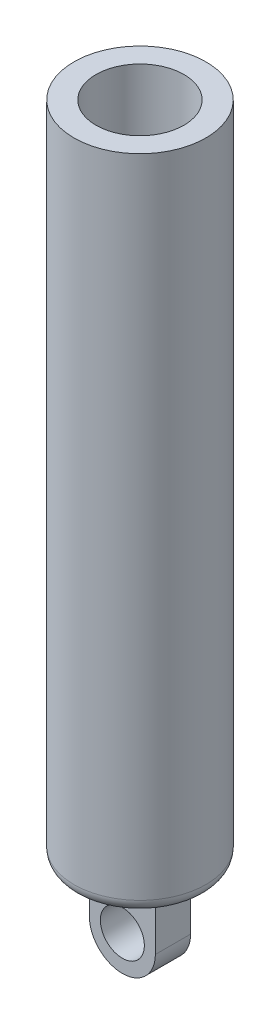
ISO-10303-21;
HEADER;
FILE_DESCRIPTION(('STEP AP214'),'2;1');
FILE_NAME('part.step','',(''),(''),'','','');
FILE_SCHEMA(('AUTOMOTIVE_DESIGN { 1 0 10303 214 1 1 1 1 }'));
ENDSEC;
DATA;
#1=APPLICATION_CONTEXT('core data for automotive mechanical design processes');
#2=APPLICATION_PROTOCOL_DEFINITION('international standard','automotive_design',2000,#1);
#3=PRODUCT_CONTEXT('',#1,'mechanical');
#4=PRODUCT('Part','Part','',(#3));
#5=PRODUCT_RELATED_PRODUCT_CATEGORY('part','',(#4));
#6=PRODUCT_DEFINITION_FORMATION('','',#4);
#7=PRODUCT_DEFINITION_CONTEXT('part definition',#1,'design');
#8=PRODUCT_DEFINITION('design','',#6,#7);
#9=PRODUCT_DEFINITION_SHAPE('','',#8);
#10=(LENGTH_UNIT() NAMED_UNIT(*) SI_UNIT(.MILLI.,.METRE.));
#11=(NAMED_UNIT(*) PLANE_ANGLE_UNIT() SI_UNIT($,.RADIAN.));
#12=(NAMED_UNIT(*) SI_UNIT($,.STERADIAN.) SOLID_ANGLE_UNIT());
#13=UNCERTAINTY_MEASURE_WITH_UNIT(LENGTH_MEASURE(1.E-05),#10,'distance_accuracy_value','');
#14=(GEOMETRIC_REPRESENTATION_CONTEXT(3) GLOBAL_UNCERTAINTY_ASSIGNED_CONTEXT((#13)) GLOBAL_UNIT_ASSIGNED_CONTEXT((#10,
#11,#12)) REPRESENTATION_CONTEXT('',''));
#15=CARTESIAN_POINT('',(0.,0.,0.));
#16=DIRECTION('',(0.,0.,1.));
#17=DIRECTION('',(1.,0.,0.));
#18=AXIS2_PLACEMENT_3D('',#15,#16,#17);
#19=CARTESIAN_POINT('',(7.5,-20.,-4.));
#20=DIRECTION('',(-1.,0.,0.));
#21=DIRECTION('',(0.,0.,1.));
#22=AXIS2_PLACEMENT_3D('',#19,#20,#21);
#23=PLANE('',#22);
#24=DIRECTION('',(0.,1.,0.));
#25=VECTOR('',#24,1.);
#26=CARTESIAN_POINT('',(7.5,-20.,4.));
#27=LINE('',#26,#25);
#28=CARTESIAN_POINT('',(7.5,-12.5,4.));
#29=VERTEX_POINT('',#28);
#30=CARTESIAN_POINT('',(7.5,0.,4.));
#31=VERTEX_POINT('',#30);
#32=EDGE_CURVE('E97',#29,#31,#27,.T.);
#33=ORIENTED_EDGE('',*,*,#32,.F.);
#34=DIRECTION('',(0.,0.,1.));
#35=VECTOR('',#34,1.);
#36=CARTESIAN_POINT('',(7.5,-12.5,-4.));
#37=LINE('',#36,#35);
#38=CARTESIAN_POINT('',(7.5,-12.5,-4.));
#39=VERTEX_POINT('',#38);
#40=EDGE_CURVE('E138',#29,#39,#37,.F.);
#41=ORIENTED_EDGE('',*,*,#40,.T.);
#42=DIRECTION('',(0.,1.,0.));
#43=VECTOR('',#42,1.);
#44=CARTESIAN_POINT('',(7.5,-20.,-4.));
#45=LINE('',#44,#43);
#46=CARTESIAN_POINT('',(7.5,0.,-4.));
#47=VERTEX_POINT('',#46);
#48=EDGE_CURVE('E120',#39,#47,#45,.T.);
#49=ORIENTED_EDGE('',*,*,#48,.T.);
#50=DIRECTION('',(0.,0.,1.));
#51=VECTOR('',#50,1.);
#52=CARTESIAN_POINT('',(7.5,0.,-4.));
#53=LINE('',#52,#51);
#54=EDGE_CURVE('E116',#47,#31,#53,.T.);
#55=ORIENTED_EDGE('',*,*,#54,.T.);
#56=EDGE_LOOP('',(#33,#41,#49,#55));
#57=FACE_BOUND('',#56,.T.);
#58=ADVANCED_FACE('F53',(#57),#23,.F.);
#59=CARTESIAN_POINT('',(-7.5,-20.,4.));
#60=DIRECTION('',(0.,0.,-1.));
#61=DIRECTION('',(-1.,0.,0.));
#62=AXIS2_PLACEMENT_3D('',#59,#60,#61);
#63=PLANE('',#62);
#64=CARTESIAN_POINT('',(0.,-12.,4.));
#65=DIRECTION('',(0.,0.,1.));
#66=DIRECTION('',(1.,0.,0.));
#67=AXIS2_PLACEMENT_3D('',#64,#65,#66);
#68=CIRCLE('',#67,5.);
#69=CARTESIAN_POINT('',(5.00000000000001,-12.,4.));
#70=VERTEX_POINT('',#69);
#71=EDGE_CURVE('E125',#70,#70,#68,.T.);
#72=ORIENTED_EDGE('',*,*,#71,.F.);
#73=EDGE_LOOP('',(#72));
#74=FACE_BOUND('',#73,.T.);
#75=CARTESIAN_POINT('',(0.,-12.5,4.));
#76=DIRECTION('',(0.,0.,-1.));
#77=DIRECTION('',(-1.,0.,0.));
#78=AXIS2_PLACEMENT_3D('',#75,#76,#77);
#79=CIRCLE('',#78,7.5);
#80=CARTESIAN_POINT('',(-7.5,-12.5,4.));
#81=VERTEX_POINT('',#80);
#82=CARTESIAN_POINT('',(0.,-20.,4.));
#83=VERTEX_POINT('',#82);
#84=EDGE_CURVE('E109',#81,#83,#79,.F.);
#85=ORIENTED_EDGE('',*,*,#84,.T.);
#86=CARTESIAN_POINT('',(0.,-12.5,4.));
#87=DIRECTION('',(0.,0.,-1.));
#88=DIRECTION('',(-1.,0.,0.));
#89=AXIS2_PLACEMENT_3D('',#86,#87,#88);
#90=CIRCLE('',#89,7.5);
#91=EDGE_CURVE('E104',#83,#29,#90,.F.);
#92=ORIENTED_EDGE('',*,*,#91,.T.);
#93=ORIENTED_EDGE('',*,*,#32,.T.);
#94=DIRECTION('',(-1.,0.,0.));
#95=VECTOR('',#94,1.);
#96=CARTESIAN_POINT('',(-7.5,0.,4.));
#97=LINE('',#96,#95);
#98=CARTESIAN_POINT('',(-7.5,0.,4.));
#99=VERTEX_POINT('',#98);
#100=EDGE_CURVE('E101',#31,#99,#97,.T.);
#101=ORIENTED_EDGE('',*,*,#100,.T.);
#102=DIRECTION('',(0.,1.,0.));
#103=VECTOR('',#102,1.);
#104=CARTESIAN_POINT('',(-7.5,-20.,4.));
#105=LINE('',#104,#103);
#106=EDGE_CURVE('E110',#81,#99,#105,.T.);
#107=ORIENTED_EDGE('',*,*,#106,.F.);
#108=EDGE_LOOP('',(#85,#92,#93,#101,#107));
#109=FACE_BOUND('',#108,.T.);
#110=ADVANCED_FACE('F99',(#74,#109),#63,.F.);
#111=CARTESIAN_POINT('',(-7.5,-20.,-4.));
#112=DIRECTION('',(1.,0.,0.));
#113=DIRECTION('',(0.,0.,-1.));
#114=AXIS2_PLACEMENT_3D('',#111,#112,#113);
#115=PLANE('',#114);
#116=DIRECTION('',(0.,1.,0.));
#117=VECTOR('',#116,1.);
#118=CARTESIAN_POINT('',(-7.5,-20.,-4.));
#119=LINE('',#118,#117);
#120=CARTESIAN_POINT('',(-7.5,-12.5,-4.));
#121=VERTEX_POINT('',#120);
#122=CARTESIAN_POINT('',(-7.5,0.,-4.));
#123=VERTEX_POINT('',#122);
#124=EDGE_CURVE('E133',#121,#123,#119,.T.);
#125=ORIENTED_EDGE('',*,*,#124,.F.);
#126=DIRECTION('',(0.,0.,-1.));
#127=VECTOR('',#126,1.);
#128=CARTESIAN_POINT('',(-7.5,-12.5,-4.));
#129=LINE('',#128,#127);
#130=EDGE_CURVE('E12',#121,#81,#129,.F.);
#131=ORIENTED_EDGE('',*,*,#130,.T.);
#132=ORIENTED_EDGE('',*,*,#106,.T.);
#133=DIRECTION('',(0.,0.,-1.));
#134=VECTOR('',#133,1.);
#135=CARTESIAN_POINT('',(-7.5,0.,-4.));
#136=LINE('',#135,#134);
#137=EDGE_CURVE('E118',#99,#123,#136,.T.);
#138=ORIENTED_EDGE('',*,*,#137,.T.);
#139=EDGE_LOOP('',(#125,#131,#132,#138));
#140=FACE_BOUND('',#139,.T.);
#141=ADVANCED_FACE('F145',(#140),#115,.F.);
#142=CARTESIAN_POINT('',(-7.5,-20.,-4.));
#143=DIRECTION('',(0.,0.,1.));
#144=DIRECTION('',(1.,0.,0.));
#145=AXIS2_PLACEMENT_3D('',#142,#143,#144);
#146=PLANE('',#145);
#147=CARTESIAN_POINT('',(0.,-12.,-4.));
#148=DIRECTION('',(0.,0.,1.));
#149=DIRECTION('',(1.,0.,0.));
#150=AXIS2_PLACEMENT_3D('',#147,#148,#149);
#151=CIRCLE('',#150,5.);
#152=CARTESIAN_POINT('',(5.00000000000001,-12.,-4.));
#153=VERTEX_POINT('',#152);
#154=EDGE_CURVE('E122',#153,#153,#151,.T.);
#155=ORIENTED_EDGE('',*,*,#154,.T.);
#156=EDGE_LOOP('',(#155));
#157=FACE_BOUND('',#156,.T.);
#158=ORIENTED_EDGE('',*,*,#48,.F.);
#159=CARTESIAN_POINT('',(0.,-12.5,-4.));
#160=DIRECTION('',(0.,0.,1.));
#161=DIRECTION('',(1.,0.,0.));
#162=AXIS2_PLACEMENT_3D('',#159,#160,#161);
#163=CIRCLE('',#162,7.5);
#164=CARTESIAN_POINT('',(0.,-20.,-4.));
#165=VERTEX_POINT('',#164);
#166=EDGE_CURVE('E62',#39,#165,#163,.F.);
#167=ORIENTED_EDGE('',*,*,#166,.T.);
#168=CARTESIAN_POINT('',(0.,-12.5,-4.));
#169=DIRECTION('',(0.,0.,1.));
#170=DIRECTION('',(1.,0.,0.));
#171=AXIS2_PLACEMENT_3D('',#168,#169,#170);
#172=CIRCLE('',#171,7.5);
#173=EDGE_CURVE('E69',#165,#121,#172,.F.);
#174=ORIENTED_EDGE('',*,*,#173,.T.);
#175=ORIENTED_EDGE('',*,*,#124,.T.);
#176=DIRECTION('',(1.,0.,0.));
#177=VECTOR('',#176,1.);
#178=CARTESIAN_POINT('',(-7.5,0.,-4.));
#179=LINE('',#178,#177);
#180=EDGE_CURVE('E130',#123,#47,#179,.T.);
#181=ORIENTED_EDGE('',*,*,#180,.T.);
#182=EDGE_LOOP('',(#158,#167,#174,#175,#181));
#183=FACE_BOUND('',#182,.T.);
#184=ADVANCED_FACE('F142',(#157,#183),#146,.F.);
#185=CARTESIAN_POINT('',(0.,0.,0.));
#186=DIRECTION('',(0.,1.,0.));
#187=DIRECTION('',(0.,0.,1.));
#188=AXIS2_PLACEMENT_3D('',#185,#186,#187);
#189=PLANE('',#188);
#190=ORIENTED_EDGE('',*,*,#54,.F.);
#191=ORIENTED_EDGE('',*,*,#180,.F.);
#192=ORIENTED_EDGE('',*,*,#137,.F.);
#193=ORIENTED_EDGE('',*,*,#100,.F.);
#194=EDGE_LOOP('',(#190,#191,#192,#193));
#195=FACE_BOUND('',#194,.T.);
#196=ADVANCED_FACE('F114',(#195),#189,.T.);
#197=CARTESIAN_POINT('',(0.,-12.,-15.));
#198=DIRECTION('',(0.,0.,1.));
#199=DIRECTION('',(1.,0.,0.));
#200=AXIS2_PLACEMENT_3D('',#197,#198,#199);
#201=CYLINDRICAL_SURFACE('',#200,5.);
#202=ORIENTED_EDGE('',*,*,#71,.T.);
#203=EDGE_LOOP('',(#202));
#204=FACE_BOUND('',#203,.T.);
#205=ORIENTED_EDGE('',*,*,#154,.F.);
#206=EDGE_LOOP('',(#205));
#207=FACE_BOUND('',#206,.T.);
#208=ADVANCED_FACE('F155',(#204,#207),#201,.F.);
#209=CARTESIAN_POINT('',(0.,-12.5,0.));
#210=DIRECTION('',(0.,0.,-1.));
#211=DIRECTION('',(-1.,0.,0.));
#212=AXIS2_PLACEMENT_3D('',#209,#210,#211);
#213=CYLINDRICAL_SURFACE('',#212,7.5);
#214=ORIENTED_EDGE('',*,*,#130,.F.);
#215=ORIENTED_EDGE('',*,*,#173,.F.);
#216=DIRECTION('',(0.,0.,-1.));
#217=VECTOR('',#216,1.);
#218=CARTESIAN_POINT('',(0.,-20.,0.));
#219=LINE('',#218,#217);
#220=EDGE_CURVE('E57',#83,#165,#219,.T.);
#221=ORIENTED_EDGE('',*,*,#220,.F.);
#222=ORIENTED_EDGE('',*,*,#84,.F.);
#223=EDGE_LOOP('',(#214,#215,#221,#222));
#224=FACE_BOUND('',#223,.T.);
#225=ADVANCED_FACE('F55',(#224),#213,.T.);
#226=CARTESIAN_POINT('',(0.,-12.5,0.));
#227=DIRECTION('',(0.,0.,1.));
#228=DIRECTION('',(1.,0.,0.));
#229=AXIS2_PLACEMENT_3D('',#226,#227,#228);
#230=CYLINDRICAL_SURFACE('',#229,7.5);
#231=ORIENTED_EDGE('',*,*,#166,.F.);
#232=ORIENTED_EDGE('',*,*,#40,.F.);
#233=ORIENTED_EDGE('',*,*,#91,.F.);
#234=ORIENTED_EDGE('',*,*,#220,.T.);
#235=EDGE_LOOP('',(#231,#232,#233,#234));
#236=FACE_BOUND('',#235,.T.);
#237=ADVANCED_FACE('F150',(#236),#230,.T.);
#238=CLOSED_SHELL('',(#58,#110,#141,#184,#196,#208,#225,#237));
#239=MANIFOLD_SOLID_BREP('B2',#238);
#240=CARTESIAN_POINT('',(0.,150.,0.));
#241=DIRECTION('',(0.,-1.,0.));
#242=DIRECTION('',(0.,0.,-1.));
#243=AXIS2_PLACEMENT_3D('',#240,#241,#242);
#244=CYLINDRICAL_SURFACE('',#243,15.);
#245=CARTESIAN_POINT('',(0.,3.,0.));
#246=DIRECTION('',(0.,1.,0.));
#247=DIRECTION('',(0.,0.,1.));
#248=AXIS2_PLACEMENT_3D('',#245,#246,#247);
#249=CIRCLE('',#248,15.);
#250=CARTESIAN_POINT('',(0.,3.,15.));
#251=VERTEX_POINT('',#250);
#252=EDGE_CURVE('E232',#251,#251,#249,.T.);
#253=ORIENTED_EDGE('',*,*,#252,.T.);
#254=EDGE_LOOP('',(#253));
#255=FACE_BOUND('',#254,.T.);
#256=CARTESIAN_POINT('',(0.,150.,0.));
#257=DIRECTION('',(0.,1.,0.));
#258=DIRECTION('',(0.,0.,1.));
#259=AXIS2_PLACEMENT_3D('',#256,#257,#258);
#260=CIRCLE('',#259,15.);
#261=CARTESIAN_POINT('',(0.,150.,15.));
#262=VERTEX_POINT('',#261);
#263=EDGE_CURVE('E237',#262,#262,#260,.T.);
#264=ORIENTED_EDGE('',*,*,#263,.F.);
#265=EDGE_LOOP('',(#264));
#266=FACE_BOUND('',#265,.T.);
#267=ADVANCED_FACE('F224',(#255,#266),#244,.T.);
#268=CARTESIAN_POINT('',(0.,150.,0.));
#269=DIRECTION('',(0.,1.,0.));
#270=DIRECTION('',(0.,0.,1.));
#271=AXIS2_PLACEMENT_3D('',#268,#269,#270);
#272=PLANE('',#271);
#273=CARTESIAN_POINT('',(0.,150.,0.));
#274=DIRECTION('',(0.,1.,0.));
#275=DIRECTION('',(0.,0.,1.));
#276=AXIS2_PLACEMENT_3D('',#273,#274,#275);
#277=CIRCLE('',#276,10.);
#278=CARTESIAN_POINT('',(0.,150.,10.));
#279=VERTEX_POINT('',#278);
#280=EDGE_CURVE('E242',#279,#279,#277,.T.);
#281=ORIENTED_EDGE('',*,*,#280,.F.);
#282=EDGE_LOOP('',(#281));
#283=FACE_BOUND('',#282,.T.);
#284=ORIENTED_EDGE('',*,*,#263,.T.);
#285=EDGE_LOOP('',(#284));
#286=FACE_BOUND('',#285,.T.);
#287=ADVANCED_FACE('F266',(#283,#286),#272,.T.);
#288=CARTESIAN_POINT('',(0.,0.,0.));
#289=DIRECTION('',(0.,1.,0.));
#290=DIRECTION('',(0.,0.,1.));
#291=AXIS2_PLACEMENT_3D('',#288,#289,#290);
#292=PLANE('',#291);
#293=CARTESIAN_POINT('',(0.,0.,0.));
#294=DIRECTION('',(0.,1.,0.));
#295=DIRECTION('',(0.,0.,1.));
#296=AXIS2_PLACEMENT_3D('',#293,#294,#295);
#297=CIRCLE('',#296,12.);
#298=CARTESIAN_POINT('',(0.,0.,12.));
#299=VERTEX_POINT('',#298);
#300=EDGE_CURVE('E52',#299,#299,#297,.F.);
#301=ORIENTED_EDGE('',*,*,#300,.T.);
#302=EDGE_LOOP('',(#301));
#303=FACE_BOUND('',#302,.T.);
#304=ADVANCED_FACE('F257',(#303),#292,.F.);
#305=CARTESIAN_POINT('',(0.,150.,0.));
#306=DIRECTION('',(0.,-1.,0.));
#307=DIRECTION('',(0.,0.,-1.));
#308=AXIS2_PLACEMENT_3D('',#305,#306,#307);
#309=CYLINDRICAL_SURFACE('',#308,10.);
#310=ORIENTED_EDGE('',*,*,#280,.T.);
#311=EDGE_LOOP('',(#310));
#312=FACE_BOUND('',#311,.T.);
#313=CARTESIAN_POINT('',(0.,5.,0.));
#314=DIRECTION('',(0.,1.,0.));
#315=DIRECTION('',(0.,0.,1.));
#316=AXIS2_PLACEMENT_3D('',#313,#314,#315);
#317=CIRCLE('',#316,10.);
#318=CARTESIAN_POINT('',(0.,5.,10.));
#319=VERTEX_POINT('',#318);
#320=EDGE_CURVE('E248',#319,#319,#317,.T.);
#321=ORIENTED_EDGE('',*,*,#320,.F.);
#322=EDGE_LOOP('',(#321));
#323=FACE_BOUND('',#322,.T.);
#324=ADVANCED_FACE('F255',(#312,#323),#309,.F.);
#325=CARTESIAN_POINT('',(0.,5.,0.));
#326=DIRECTION('',(0.,1.,0.));
#327=DIRECTION('',(0.,0.,1.));
#328=AXIS2_PLACEMENT_3D('',#325,#326,#327);
#329=PLANE('',#328);
#330=ORIENTED_EDGE('',*,*,#320,.T.);
#331=EDGE_LOOP('',(#330));
#332=FACE_BOUND('',#331,.T.);
#333=ADVANCED_FACE('F253',(#332),#329,.T.);
#334=CARTESIAN_POINT('',(0.,3.,0.));
#335=DIRECTION('',(0.,1.,0.));
#336=DIRECTION('',(0.,0.,1.));
#337=AXIS2_PLACEMENT_3D('',#334,#335,#336);
#338=TOROIDAL_SURFACE('',#337,12.,3.);
#339=ORIENTED_EDGE('',*,*,#300,.F.);
#340=EDGE_LOOP('',(#339));
#341=FACE_BOUND('',#340,.T.);
#342=ORIENTED_EDGE('',*,*,#252,.F.);
#343=EDGE_LOOP('',(#342));
#344=FACE_BOUND('',#343,.T.);
#345=ADVANCED_FACE('F226',(#341,#344),#338,.T.);
#346=CLOSED_SHELL('',(#267,#287,#304,#324,#333,#345));
#347=MANIFOLD_SOLID_BREP('B6',#346);
#348=ADVANCED_BREP_SHAPE_REPRESENTATION('',(#18,#239,#347),#14);
#349=SHAPE_DEFINITION_REPRESENTATION(#9,#348);
ENDSEC;
END-ISO-10303-21;
